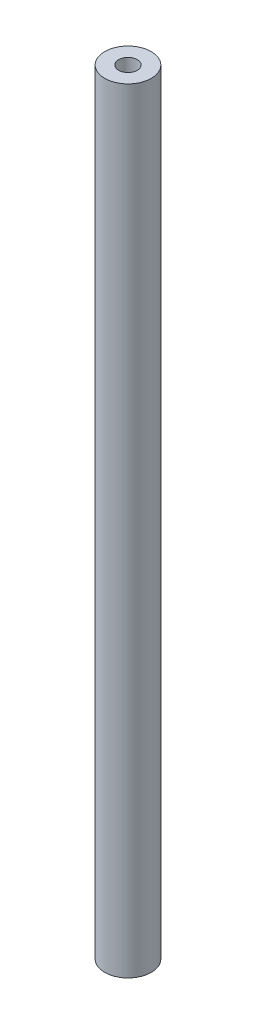
ISO-10303-21;
HEADER;
FILE_DESCRIPTION(('STEP AP214'),'2;1');
FILE_NAME('part.step','',(''),(''),'','','');
FILE_SCHEMA(('AUTOMOTIVE_DESIGN { 1 0 10303 214 1 1 1 1 }'));
ENDSEC;
DATA;
#1=APPLICATION_CONTEXT('core data for automotive mechanical design processes');
#2=APPLICATION_PROTOCOL_DEFINITION('international standard','automotive_design',2000,#1);
#3=PRODUCT_CONTEXT('',#1,'mechanical');
#4=PRODUCT('Part','Part','',(#3));
#5=PRODUCT_RELATED_PRODUCT_CATEGORY('part','',(#4));
#6=PRODUCT_DEFINITION_FORMATION('','',#4);
#7=PRODUCT_DEFINITION_CONTEXT('part definition',#1,'design');
#8=PRODUCT_DEFINITION('design','',#6,#7);
#9=PRODUCT_DEFINITION_SHAPE('','',#8);
#10=(LENGTH_UNIT() NAMED_UNIT(*) SI_UNIT(.MILLI.,.METRE.));
#11=(NAMED_UNIT(*) PLANE_ANGLE_UNIT() SI_UNIT($,.RADIAN.));
#12=(NAMED_UNIT(*) SI_UNIT($,.STERADIAN.) SOLID_ANGLE_UNIT());
#13=UNCERTAINTY_MEASURE_WITH_UNIT(LENGTH_MEASURE(1.E-05),#10,'distance_accuracy_value','');
#14=(GEOMETRIC_REPRESENTATION_CONTEXT(3) GLOBAL_UNCERTAINTY_ASSIGNED_CONTEXT((#13)) GLOBAL_UNIT_ASSIGNED_CONTEXT((#10,
#11,#12)) REPRESENTATION_CONTEXT('',''));
#15=CARTESIAN_POINT('',(0.,0.,0.));
#16=DIRECTION('',(0.,0.,1.));
#17=DIRECTION('',(1.,0.,0.));
#18=AXIS2_PLACEMENT_3D('',#15,#16,#17);
#19=CARTESIAN_POINT('',(0.,-250.,0.));
#20=DIRECTION('',(0.,1.,0.));
#21=DIRECTION('',(0.,0.,1.));
#22=AXIS2_PLACEMENT_3D('',#19,#20,#21);
#23=CYLINDRICAL_SURFACE('',#22,15.);
#24=CARTESIAN_POINT('',(0.,-250.,0.));
#25=DIRECTION('',(0.,1.,0.));
#26=DIRECTION('',(0.,0.,1.));
#27=AXIS2_PLACEMENT_3D('',#24,#25,#26);
#28=CIRCLE('',#27,15.);
#29=CARTESIAN_POINT('',(0.,-250.,15.));
#30=VERTEX_POINT('',#29);
#31=EDGE_CURVE('E116',#30,#30,#28,.T.);
#32=ORIENTED_EDGE('',*,*,#31,.T.);
#33=EDGE_LOOP('',(#32));
#34=FACE_BOUND('',#33,.T.);
#35=CARTESIAN_POINT('',(0.,250.,0.));
#36=DIRECTION('',(0.,1.,0.));
#37=DIRECTION('',(0.,0.,1.));
#38=AXIS2_PLACEMENT_3D('',#35,#36,#37);
#39=CIRCLE('',#38,15.);
#40=CARTESIAN_POINT('',(0.,250.,15.));
#41=VERTEX_POINT('',#40);
#42=EDGE_CURVE('E113',#41,#41,#39,.T.);
#43=ORIENTED_EDGE('',*,*,#42,.F.);
#44=EDGE_LOOP('',(#43));
#45=FACE_BOUND('',#44,.T.);
#46=ADVANCED_FACE('F37',(#34,#45),#23,.T.);
#47=CARTESIAN_POINT('',(0.,-250.,0.));
#48=DIRECTION('',(0.,1.,0.));
#49=DIRECTION('',(0.,0.,1.));
#50=AXIS2_PLACEMENT_3D('',#47,#48,#49);
#51=PLANE('',#50);
#52=CARTESIAN_POINT('',(0.,-250.,0.));
#53=DIRECTION('',(0.,1.,0.));
#54=DIRECTION('',(0.,0.,1.));
#55=AXIS2_PLACEMENT_3D('',#52,#53,#54);
#56=CIRCLE('',#55,6.);
#57=CARTESIAN_POINT('',(0.,-250.,6.));
#58=VERTEX_POINT('',#57);
#59=EDGE_CURVE('E110',#58,#58,#56,.T.);
#60=ORIENTED_EDGE('',*,*,#59,.T.);
#61=EDGE_LOOP('',(#60));
#62=FACE_BOUND('',#61,.T.);
#63=ORIENTED_EDGE('',*,*,#31,.F.);
#64=EDGE_LOOP('',(#63));
#65=FACE_BOUND('',#64,.T.);
#66=ADVANCED_FACE('F136',(#62,#65),#51,.F.);
#67=CARTESIAN_POINT('',(0.,250.,0.));
#68=DIRECTION('',(0.,1.,0.));
#69=DIRECTION('',(0.,0.,1.));
#70=AXIS2_PLACEMENT_3D('',#67,#68,#69);
#71=PLANE('',#70);
#72=CARTESIAN_POINT('',(0.,250.,0.));
#73=DIRECTION('',(0.,1.,0.));
#74=DIRECTION('',(0.,0.,1.));
#75=AXIS2_PLACEMENT_3D('',#72,#73,#74);
#76=CIRCLE('',#75,6.);
#77=CARTESIAN_POINT('',(0.,250.,6.));
#78=VERTEX_POINT('',#77);
#79=EDGE_CURVE('E107',#78,#78,#76,.T.);
#80=ORIENTED_EDGE('',*,*,#79,.F.);
#81=EDGE_LOOP('',(#80));
#82=FACE_BOUND('',#81,.T.);
#83=ORIENTED_EDGE('',*,*,#42,.T.);
#84=EDGE_LOOP('',(#83));
#85=FACE_BOUND('',#84,.T.);
#86=ADVANCED_FACE('F141',(#82,#85),#71,.T.);
#87=CARTESIAN_POINT('',(0.,-250.,0.));
#88=DIRECTION('',(0.,1.,0.));
#89=DIRECTION('',(0.,0.,1.));
#90=AXIS2_PLACEMENT_3D('',#87,#88,#89);
#91=CYLINDRICAL_SURFACE('',#90,6.);
#92=DIRECTION('',(0.,-1.,0.));
#93=VECTOR('',#92,1.);
#94=CARTESIAN_POINT('',(-6.,200.,0.));
#95=LINE('',#94,#93);
#96=CARTESIAN_POINT('',(-6.,200.,0.));
#97=VERTEX_POINT('',#96);
#98=CARTESIAN_POINT('',(-5.99999999999999,174.999998923679,0.));
#99=VERTEX_POINT('',#98);
#100=EDGE_CURVE('E86',#97,#99,#95,.T.);
#101=ORIENTED_EDGE('',*,*,#100,.F.);
#102=CARTESIAN_POINT('',(0.,200.,0.));
#103=DIRECTION('',(0.,0.707106781186547,0.707106781186547));
#104=DIRECTION('',(0.,0.707106781186547,-0.707106781186547));
#105=AXIS2_PLACEMENT_3D('',#102,#103,#104);
#106=ELLIPSE('',#105,8.48528137423857,6.);
#107=CARTESIAN_POINT('',(6.,200.,0.));
#108=VERTEX_POINT('',#107);
#109=EDGE_CURVE('E11',#97,#108,#106,.F.);
#110=ORIENTED_EDGE('',*,*,#109,.T.);
#111=DIRECTION('',(0.,1.,0.));
#112=VECTOR('',#111,1.);
#113=CARTESIAN_POINT('',(6.,200.,0.));
#114=LINE('',#113,#112);
#115=CARTESIAN_POINT('',(6.,174.999998923679,0.));
#116=VERTEX_POINT('',#115);
#117=EDGE_CURVE('E100',#116,#108,#114,.T.);
#118=ORIENTED_EDGE('',*,*,#117,.F.);
#119=CARTESIAN_POINT('',(0.,174.999998923679,0.));
#120=DIRECTION('',(0.,0.707106781186547,-0.707106781186547));
#121=DIRECTION('',(0.,0.707106781186547,0.707106781186547));
#122=AXIS2_PLACEMENT_3D('',#119,#120,#121);
#123=ELLIPSE('',#122,8.48528137423857,6.);
#124=EDGE_CURVE('E44',#116,#99,#123,.T.);
#125=ORIENTED_EDGE('',*,*,#124,.T.);
#126=EDGE_LOOP('',(#101,#110,#118,#125));
#127=FACE_BOUND('',#126,.T.);
#128=ORIENTED_EDGE('',*,*,#59,.F.);
#129=EDGE_LOOP('',(#128));
#130=FACE_BOUND('',#129,.T.);
#131=ORIENTED_EDGE('',*,*,#79,.T.);
#132=EDGE_LOOP('',(#131));
#133=FACE_BOUND('',#132,.T.);
#134=ADVANCED_FACE('F122',(#127,#130,#133),#91,.F.);
#135=CARTESIAN_POINT('',(0.,200.,-12.));
#136=DIRECTION('',(0.,0.,1.));
#137=DIRECTION('',(1.,0.,0.));
#138=AXIS2_PLACEMENT_3D('',#135,#136,#137);
#139=CYLINDRICAL_SURFACE('',#138,6.);
#140=DIRECTION('',(0.,0.,1.));
#141=VECTOR('',#140,1.);
#142=CARTESIAN_POINT('',(-6.,200.,-12.));
#143=LINE('',#142,#141);
#144=CARTESIAN_POINT('',(-6.,200.,-12.));
#145=VERTEX_POINT('',#144);
#146=EDGE_CURVE('E74',#145,#97,#143,.T.);
#147=ORIENTED_EDGE('',*,*,#146,.F.);
#148=CARTESIAN_POINT('',(0.,200.,-12.));
#149=DIRECTION('',(0.,0.,1.));
#150=DIRECTION('',(-1.,0.,0.));
#151=AXIS2_PLACEMENT_3D('',#148,#149,#150);
#152=CIRCLE('',#151,6.);
#153=CARTESIAN_POINT('',(6.,200.,-12.));
#154=VERTEX_POINT('',#153);
#155=EDGE_CURVE('E98',#154,#145,#152,.T.);
#156=ORIENTED_EDGE('',*,*,#155,.F.);
#157=DIRECTION('',(0.,0.,1.));
#158=VECTOR('',#157,1.);
#159=CARTESIAN_POINT('',(6.,200.,-12.));
#160=LINE('',#159,#158);
#161=EDGE_CURVE('E57',#154,#108,#160,.T.);
#162=ORIENTED_EDGE('',*,*,#161,.T.);
#163=ORIENTED_EDGE('',*,*,#109,.F.);
#164=EDGE_LOOP('',(#147,#156,#162,#163));
#165=FACE_BOUND('',#164,.T.);
#166=ADVANCED_FACE('F132',(#165),#139,.F.);
#167=CARTESIAN_POINT('',(0.,174.999998923679,-12.));
#168=DIRECTION('',(0.,0.,1.));
#169=DIRECTION('',(1.,0.,0.));
#170=AXIS2_PLACEMENT_3D('',#167,#168,#169);
#171=CYLINDRICAL_SURFACE('',#170,6.);
#172=DIRECTION('',(0.,0.,1.));
#173=VECTOR('',#172,1.);
#174=CARTESIAN_POINT('',(6.,174.999998923679,-12.));
#175=LINE('',#174,#173);
#176=CARTESIAN_POINT('',(6.,174.999998923679,-12.));
#177=VERTEX_POINT('',#176);
#178=EDGE_CURVE('E51',#177,#116,#175,.T.);
#179=ORIENTED_EDGE('',*,*,#178,.F.);
#180=CARTESIAN_POINT('',(0.,174.999998923679,-12.));
#181=DIRECTION('',(0.,0.,1.));
#182=DIRECTION('',(1.,0.,0.));
#183=AXIS2_PLACEMENT_3D('',#180,#181,#182);
#184=CIRCLE('',#183,6.);
#185=CARTESIAN_POINT('',(-5.99999999999999,174.999998923679,-12.));
#186=VERTEX_POINT('',#185);
#187=EDGE_CURVE('E91',#186,#177,#184,.T.);
#188=ORIENTED_EDGE('',*,*,#187,.F.);
#189=DIRECTION('',(0.,0.,1.));
#190=VECTOR('',#189,1.);
#191=CARTESIAN_POINT('',(-5.99999999999999,174.999998923679,-12.));
#192=LINE('',#191,#190);
#193=EDGE_CURVE('E79',#186,#99,#192,.T.);
#194=ORIENTED_EDGE('',*,*,#193,.T.);
#195=ORIENTED_EDGE('',*,*,#124,.F.);
#196=EDGE_LOOP('',(#179,#188,#194,#195));
#197=FACE_BOUND('',#196,.T.);
#198=ADVANCED_FACE('F92',(#197),#171,.F.);
#199=CARTESIAN_POINT('',(6.,200.,-12.));
#200=DIRECTION('',(1.,0.,0.));
#201=DIRECTION('',(0.,1.,0.));
#202=AXIS2_PLACEMENT_3D('',#199,#200,#201);
#203=PLANE('',#202);
#204=ORIENTED_EDGE('',*,*,#117,.T.);
#205=ORIENTED_EDGE('',*,*,#161,.F.);
#206=DIRECTION('',(0.,1.,0.));
#207=VECTOR('',#206,1.);
#208=CARTESIAN_POINT('',(6.,200.,-12.));
#209=LINE('',#208,#207);
#210=EDGE_CURVE('E95',#177,#154,#209,.T.);
#211=ORIENTED_EDGE('',*,*,#210,.F.);
#212=ORIENTED_EDGE('',*,*,#178,.T.);
#213=EDGE_LOOP('',(#204,#205,#211,#212));
#214=FACE_BOUND('',#213,.T.);
#215=ADVANCED_FACE('F124',(#214),#203,.F.);
#216=CARTESIAN_POINT('',(-6.,200.,-12.));
#217=DIRECTION('',(-1.,0.,0.));
#218=DIRECTION('',(0.,-1.,0.));
#219=AXIS2_PLACEMENT_3D('',#216,#217,#218);
#220=PLANE('',#219);
#221=ORIENTED_EDGE('',*,*,#100,.T.);
#222=ORIENTED_EDGE('',*,*,#193,.F.);
#223=DIRECTION('',(0.,-1.,0.));
#224=VECTOR('',#223,1.);
#225=CARTESIAN_POINT('',(-6.,200.,-12.));
#226=LINE('',#225,#224);
#227=EDGE_CURVE('E83',#145,#186,#226,.T.);
#228=ORIENTED_EDGE('',*,*,#227,.F.);
#229=ORIENTED_EDGE('',*,*,#146,.T.);
#230=EDGE_LOOP('',(#221,#222,#228,#229));
#231=FACE_BOUND('',#230,.T.);
#232=ADVANCED_FACE('F81',(#231),#220,.F.);
#233=CARTESIAN_POINT('',(0.,200.,-12.));
#234=DIRECTION('',(0.,0.,-1.));
#235=DIRECTION('',(-1.,0.,0.));
#236=AXIS2_PLACEMENT_3D('',#233,#234,#235);
#237=PLANE('',#236);
#238=ORIENTED_EDGE('',*,*,#155,.T.);
#239=ORIENTED_EDGE('',*,*,#227,.T.);
#240=ORIENTED_EDGE('',*,*,#187,.T.);
#241=ORIENTED_EDGE('',*,*,#210,.T.);
#242=EDGE_LOOP('',(#238,#239,#240,#241));
#243=FACE_BOUND('',#242,.T.);
#244=ADVANCED_FACE('F97',(#243),#237,.F.);
#245=CLOSED_SHELL('',(#46,#66,#86,#134,#166,#198,#215,#232,#244));
#246=MANIFOLD_SOLID_BREP('B2',#245);
#247=ADVANCED_BREP_SHAPE_REPRESENTATION('',(#18,#246),#14);
#248=SHAPE_DEFINITION_REPRESENTATION(#9,#247);
ENDSEC;
END-ISO-10303-21;
